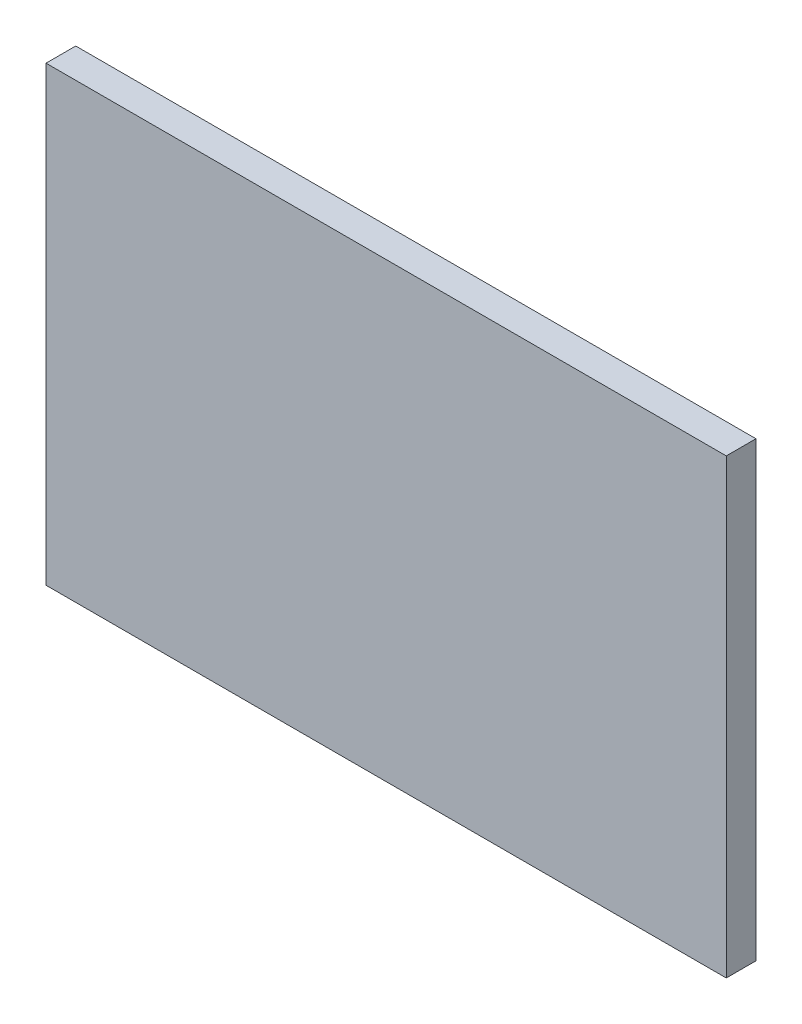
ISO-10303-21;
HEADER;
FILE_DESCRIPTION(('STEP AP214'),'2;1');
FILE_NAME('part.step','',(''),(''),'','','');
FILE_SCHEMA(('AUTOMOTIVE_DESIGN { 1 0 10303 214 1 1 1 1 }'));
ENDSEC;
DATA;
#1=APPLICATION_CONTEXT('core data for automotive mechanical design processes');
#2=APPLICATION_PROTOCOL_DEFINITION('international standard','automotive_design',2000,#1);
#3=PRODUCT_CONTEXT('',#1,'mechanical');
#4=PRODUCT('Part','Part','',(#3));
#5=PRODUCT_RELATED_PRODUCT_CATEGORY('part','',(#4));
#6=PRODUCT_DEFINITION_FORMATION('','',#4);
#7=PRODUCT_DEFINITION_CONTEXT('part definition',#1,'design');
#8=PRODUCT_DEFINITION('design','',#6,#7);
#9=PRODUCT_DEFINITION_SHAPE('','',#8);
#10=(LENGTH_UNIT() NAMED_UNIT(*) SI_UNIT(.MILLI.,.METRE.));
#11=(NAMED_UNIT(*) PLANE_ANGLE_UNIT() SI_UNIT($,.RADIAN.));
#12=(NAMED_UNIT(*) SI_UNIT($,.STERADIAN.) SOLID_ANGLE_UNIT());
#13=UNCERTAINTY_MEASURE_WITH_UNIT(LENGTH_MEASURE(1.E-05),#10,'distance_accuracy_value','');
#14=(GEOMETRIC_REPRESENTATION_CONTEXT(3) GLOBAL_UNCERTAINTY_ASSIGNED_CONTEXT((#13)) GLOBAL_UNIT_ASSIGNED_CONTEXT((#10,
#11,#12)) REPRESENTATION_CONTEXT('',''));
#15=CARTESIAN_POINT('',(0.,0.,0.));
#16=DIRECTION('',(0.,0.,1.));
#17=DIRECTION('',(1.,0.,0.));
#18=AXIS2_PLACEMENT_3D('',#15,#16,#17);
#19=CARTESIAN_POINT('',(228.906945408339,643.113224095209,-125.));
#20=DIRECTION('',(-1.,0.,0.));
#21=DIRECTION('',(0.,0.,1.));
#22=AXIS2_PLACEMENT_3D('',#19,#20,#21);
#23=PLANE('',#22);
#24=DIRECTION('',(0.,1.,0.));
#25=VECTOR('',#24,1.);
#26=CARTESIAN_POINT('',(228.906945408339,643.113224095209,-145.));
#27=LINE('',#26,#25);
#28=CARTESIAN_POINT('',(228.906945408339,338.796596730207,-145.));
#29=VERTEX_POINT('',#28);
#30=CARTESIAN_POINT('',(228.906945408339,643.113224095209,-145.));
#31=VERTEX_POINT('',#30);
#32=EDGE_CURVE('E97',#29,#31,#27,.T.);
#33=ORIENTED_EDGE('',*,*,#32,.T.);
#34=DIRECTION('',(0.,0.,-1.));
#35=VECTOR('',#34,1.);
#36=CARTESIAN_POINT('',(228.906945408339,643.113224095209,-125.));
#37=LINE('',#36,#35);
#38=CARTESIAN_POINT('',(228.906945408339,643.113224095209,-125.));
#39=VERTEX_POINT('',#38);
#40=EDGE_CURVE('E11',#39,#31,#37,.T.);
#41=ORIENTED_EDGE('',*,*,#40,.F.);
#42=DIRECTION('',(0.,1.,0.));
#43=VECTOR('',#42,1.);
#44=CARTESIAN_POINT('',(228.906945408339,643.113224095209,-125.));
#45=LINE('',#44,#43);
#46=CARTESIAN_POINT('',(228.906945408339,338.796596730207,-125.));
#47=VERTEX_POINT('',#46);
#48=EDGE_CURVE('E85',#47,#39,#45,.T.);
#49=ORIENTED_EDGE('',*,*,#48,.F.);
#50=DIRECTION('',(0.,0.,-1.));
#51=VECTOR('',#50,1.);
#52=CARTESIAN_POINT('',(228.906945408339,338.796596730207,-125.));
#53=LINE('',#52,#51);
#54=EDGE_CURVE('E93',#47,#29,#53,.T.);
#55=ORIENTED_EDGE('',*,*,#54,.T.);
#56=EDGE_LOOP('',(#33,#41,#49,#55));
#57=FACE_BOUND('',#56,.T.);
#58=ADVANCED_FACE('F34',(#57),#23,.F.);
#59=CARTESIAN_POINT('',(-228.90694540834,643.113224095209,-125.));
#60=DIRECTION('',(0.,-1.,0.));
#61=DIRECTION('',(0.,0.,-1.));
#62=AXIS2_PLACEMENT_3D('',#59,#60,#61);
#63=PLANE('',#62);
#64=DIRECTION('',(-1.,0.,0.));
#65=VECTOR('',#64,1.);
#66=CARTESIAN_POINT('',(-228.90694540834,643.113224095209,-145.));
#67=LINE('',#66,#65);
#68=CARTESIAN_POINT('',(-228.90694540834,643.113224095209,-145.));
#69=VERTEX_POINT('',#68);
#70=EDGE_CURVE('E89',#31,#69,#67,.T.);
#71=ORIENTED_EDGE('',*,*,#70,.T.);
#72=DIRECTION('',(0.,0.,-1.));
#73=VECTOR('',#72,1.);
#74=CARTESIAN_POINT('',(-228.90694540834,643.113224095209,-125.));
#75=LINE('',#74,#73);
#76=CARTESIAN_POINT('',(-228.90694540834,643.113224095209,-125.));
#77=VERTEX_POINT('',#76);
#78=EDGE_CURVE('E42',#77,#69,#75,.T.);
#79=ORIENTED_EDGE('',*,*,#78,.F.);
#80=DIRECTION('',(-1.,0.,0.));
#81=VECTOR('',#80,1.);
#82=CARTESIAN_POINT('',(-228.90694540834,643.113224095209,-125.));
#83=LINE('',#82,#81);
#84=EDGE_CURVE('E80',#39,#77,#83,.T.);
#85=ORIENTED_EDGE('',*,*,#84,.F.);
#86=ORIENTED_EDGE('',*,*,#40,.T.);
#87=EDGE_LOOP('',(#71,#79,#85,#86));
#88=FACE_BOUND('',#87,.T.);
#89=ADVANCED_FACE('F88',(#88),#63,.F.);
#90=CARTESIAN_POINT('',(-228.90694540834,643.113224095209,-125.));
#91=DIRECTION('',(1.,0.,0.));
#92=DIRECTION('',(0.,0.,-1.));
#93=AXIS2_PLACEMENT_3D('',#90,#91,#92);
#94=PLANE('',#93);
#95=DIRECTION('',(0.,-1.,0.));
#96=VECTOR('',#95,1.);
#97=CARTESIAN_POINT('',(-228.90694540834,643.113224095209,-145.));
#98=LINE('',#97,#96);
#99=CARTESIAN_POINT('',(-228.90694540834,338.796596730207,-145.));
#100=VERTEX_POINT('',#99);
#101=EDGE_CURVE('E67',#69,#100,#98,.T.);
#102=ORIENTED_EDGE('',*,*,#101,.T.);
#103=DIRECTION('',(0.,0.,-1.));
#104=VECTOR('',#103,1.);
#105=CARTESIAN_POINT('',(-228.90694540834,338.796596730207,-125.));
#106=LINE('',#105,#104);
#107=CARTESIAN_POINT('',(-228.90694540834,338.796596730207,-125.));
#108=VERTEX_POINT('',#107);
#109=EDGE_CURVE('E90',#108,#100,#106,.T.);
#110=ORIENTED_EDGE('',*,*,#109,.F.);
#111=DIRECTION('',(0.,-1.,0.));
#112=VECTOR('',#111,1.);
#113=CARTESIAN_POINT('',(-228.90694540834,643.113224095209,-125.));
#114=LINE('',#113,#112);
#115=EDGE_CURVE('E83',#77,#108,#114,.T.);
#116=ORIENTED_EDGE('',*,*,#115,.F.);
#117=ORIENTED_EDGE('',*,*,#78,.T.);
#118=EDGE_LOOP('',(#102,#110,#116,#117));
#119=FACE_BOUND('',#118,.T.);
#120=ADVANCED_FACE('F91',(#119),#94,.F.);
#121=CARTESIAN_POINT('',(-228.90694540834,338.796596730207,-125.));
#122=DIRECTION('',(0.,1.,0.));
#123=DIRECTION('',(0.,0.,1.));
#124=AXIS2_PLACEMENT_3D('',#121,#122,#123);
#125=PLANE('',#124);
#126=DIRECTION('',(1.,0.,0.));
#127=VECTOR('',#126,1.);
#128=CARTESIAN_POINT('',(-228.90694540834,338.796596730207,-145.));
#129=LINE('',#128,#127);
#130=EDGE_CURVE('E73',#100,#29,#129,.T.);
#131=ORIENTED_EDGE('',*,*,#130,.T.);
#132=ORIENTED_EDGE('',*,*,#54,.F.);
#133=DIRECTION('',(1.,0.,0.));
#134=VECTOR('',#133,1.);
#135=CARTESIAN_POINT('',(-228.90694540834,338.796596730207,-125.));
#136=LINE('',#135,#134);
#137=EDGE_CURVE('E50',#108,#47,#136,.T.);
#138=ORIENTED_EDGE('',*,*,#137,.F.);
#139=ORIENTED_EDGE('',*,*,#109,.T.);
#140=EDGE_LOOP('',(#131,#132,#138,#139));
#141=FACE_BOUND('',#140,.T.);
#142=ADVANCED_FACE('F104',(#141),#125,.F.);
#143=CARTESIAN_POINT('',(0.,0.,-125.));
#144=DIRECTION('',(0.,0.,1.));
#145=DIRECTION('',(1.,0.,0.));
#146=AXIS2_PLACEMENT_3D('',#143,#144,#145);
#147=PLANE('',#146);
#148=ORIENTED_EDGE('',*,*,#48,.T.);
#149=ORIENTED_EDGE('',*,*,#84,.T.);
#150=ORIENTED_EDGE('',*,*,#115,.T.);
#151=ORIENTED_EDGE('',*,*,#137,.T.);
#152=EDGE_LOOP('',(#148,#149,#150,#151));
#153=FACE_BOUND('',#152,.T.);
#154=ADVANCED_FACE('F81',(#153),#147,.T.);
#155=CARTESIAN_POINT('',(0.,0.,-145.));
#156=DIRECTION('',(0.,0.,1.));
#157=DIRECTION('',(1.,0.,0.));
#158=AXIS2_PLACEMENT_3D('',#155,#156,#157);
#159=PLANE('',#158);
#160=ORIENTED_EDGE('',*,*,#32,.F.);
#161=ORIENTED_EDGE('',*,*,#130,.F.);
#162=ORIENTED_EDGE('',*,*,#101,.F.);
#163=ORIENTED_EDGE('',*,*,#70,.F.);
#164=EDGE_LOOP('',(#160,#161,#162,#163));
#165=FACE_BOUND('',#164,.T.);
#166=ADVANCED_FACE('F107',(#165),#159,.F.);
#167=CLOSED_SHELL('',(#58,#89,#120,#142,#154,#166));
#168=MANIFOLD_SOLID_BREP('B2',#167);
#169=ADVANCED_BREP_SHAPE_REPRESENTATION('',(#18,#168),#14);
#170=SHAPE_DEFINITION_REPRESENTATION(#9,#169);
ENDSEC;
END-ISO-10303-21;
